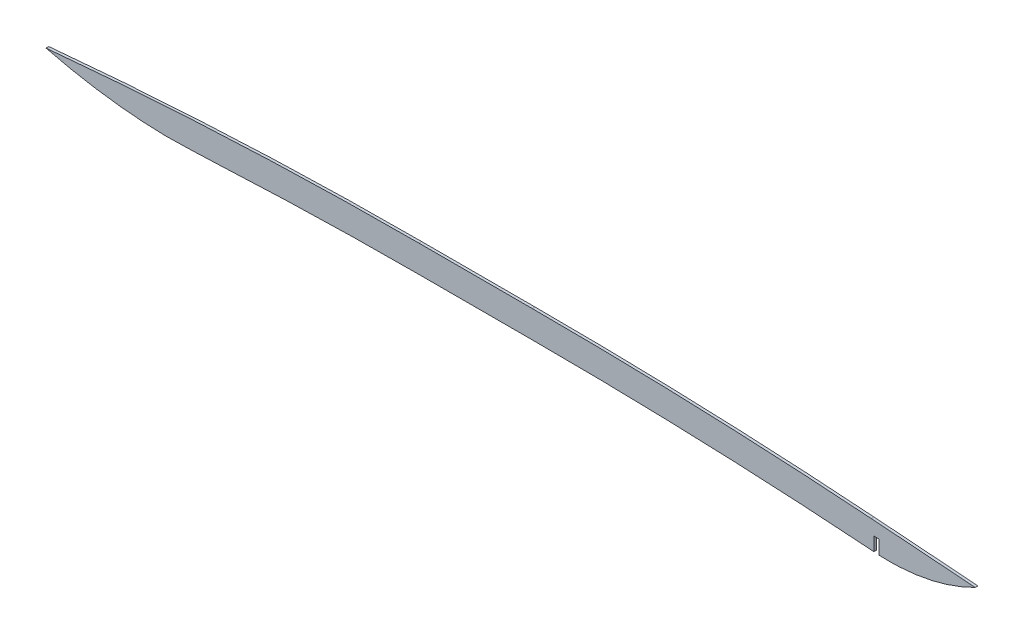
ISO-10303-21;
HEADER;
FILE_DESCRIPTION(('STEP AP214'),'2;1');
FILE_NAME('part.step','',(''),(''),'','','');
FILE_SCHEMA(('AUTOMOTIVE_DESIGN { 1 0 10303 214 1 1 1 1 }'));
ENDSEC;
DATA;
#1=APPLICATION_CONTEXT('core data for automotive mechanical design processes');
#2=APPLICATION_PROTOCOL_DEFINITION('international standard','automotive_design',2000,#1);
#3=PRODUCT_CONTEXT('',#1,'mechanical');
#4=PRODUCT('Part','Part','',(#3));
#5=PRODUCT_RELATED_PRODUCT_CATEGORY('part','',(#4));
#6=PRODUCT_DEFINITION_FORMATION('','',#4);
#7=PRODUCT_DEFINITION_CONTEXT('part definition',#1,'design');
#8=PRODUCT_DEFINITION('design','',#6,#7);
#9=PRODUCT_DEFINITION_SHAPE('','',#8);
#10=(LENGTH_UNIT() NAMED_UNIT(*) SI_UNIT(.MILLI.,.METRE.));
#11=(NAMED_UNIT(*) PLANE_ANGLE_UNIT() SI_UNIT($,.RADIAN.));
#12=(NAMED_UNIT(*) SI_UNIT($,.STERADIAN.) SOLID_ANGLE_UNIT());
#13=UNCERTAINTY_MEASURE_WITH_UNIT(LENGTH_MEASURE(1.E-05),#10,'distance_accuracy_value','');
#14=(GEOMETRIC_REPRESENTATION_CONTEXT(3) GLOBAL_UNCERTAINTY_ASSIGNED_CONTEXT((#13)) GLOBAL_UNIT_ASSIGNED_CONTEXT((#10,
#11,#12)) REPRESENTATION_CONTEXT('',''));
#15=CARTESIAN_POINT('',(0.,0.,0.));
#16=DIRECTION('',(0.,0.,1.));
#17=DIRECTION('',(1.,0.,0.));
#18=AXIS2_PLACEMENT_3D('',#15,#16,#17);
#19=CARTESIAN_POINT('',(1659.56612162198,-14511.4610731583,10.));
#20=DIRECTION('',(0.,0.,-1.));
#21=DIRECTION('',(-1.,0.,0.));
#22=AXIS2_PLACEMENT_3D('',#19,#20,#21);
#23=CYLINDRICAL_SURFACE('',#22,14606.0488219718);
#24=CARTESIAN_POINT('',(1659.56612162198,-14511.4610731583,0.));
#25=DIRECTION('',(0.,0.,1.));
#26=DIRECTION('',(1.,0.,0.));
#27=AXIS2_PLACEMENT_3D('',#24,#25,#26);
#28=CIRCLE('',#27,14606.0488219718);
#29=CARTESIAN_POINT('',(1659.56612162198,94.587748813508,0.));
#30=VERTEX_POINT('',#29);
#31=CARTESIAN_POINT('',(286.252176699048,29.88243418325,0.));
#32=VERTEX_POINT('',#31);
#33=EDGE_CURVE('E173',#30,#32,#28,.T.);
#34=ORIENTED_EDGE('',*,*,#33,.T.);
#35=DIRECTION('',(0.,0.,-1.));
#36=VECTOR('',#35,1.);
#37=CARTESIAN_POINT('',(286.252176699048,29.88243418325,10.));
#38=LINE('',#37,#36);
#39=CARTESIAN_POINT('',(286.252176699048,29.88243418325,10.));
#40=VERTEX_POINT('',#39);
#41=EDGE_CURVE('E11',#40,#32,#38,.T.);
#42=ORIENTED_EDGE('',*,*,#41,.F.);
#43=CARTESIAN_POINT('',(1659.56612162198,-14511.4610731583,10.));
#44=DIRECTION('',(0.,0.,1.));
#45=DIRECTION('',(1.,0.,0.));
#46=AXIS2_PLACEMENT_3D('',#43,#44,#45);
#47=CIRCLE('',#46,14606.0488219718);
#48=CARTESIAN_POINT('',(1659.56612162198,94.587748813508,10.));
#49=VERTEX_POINT('',#48);
#50=EDGE_CURVE('E227',#49,#40,#47,.T.);
#51=ORIENTED_EDGE('',*,*,#50,.F.);
#52=DIRECTION('',(0.,0.,-1.));
#53=VECTOR('',#52,1.);
#54=CARTESIAN_POINT('',(1659.56612162198,94.587748813508,10.));
#55=LINE('',#54,#53);
#56=EDGE_CURVE('E69',#49,#30,#55,.T.);
#57=ORIENTED_EDGE('',*,*,#56,.T.);
#58=EDGE_LOOP('',(#34,#42,#51,#57));
#59=FACE_BOUND('',#58,.T.);
#60=ADVANCED_FACE('F45',(#59),#23,.T.);
#61=CARTESIAN_POINT('',(286.252176699048,29.88243418325,10.));
#62=CARTESIAN_POINT('',(603.987522970232,-50.6580309408044,10.));
#63=CARTESIAN_POINT('',(927.370608085943,-23.9028884472763,10.));
#64=B_SPLINE_CURVE_WITH_KNOTS('',2,(#61,#62,#63),.UNSPECIFIED.,.F.,.F.,(3,3),(0.,1.),.UNSPECIFIED.);
#65=DIRECTION('',(0.,0.,-1.));
#66=VECTOR('',#65,1.);
#67=SURFACE_OF_LINEAR_EXTRUSION('',#64,#66);
#68=CARTESIAN_POINT('',(286.252176699048,29.88243418325,0.));
#69=CARTESIAN_POINT('',(603.987522970232,-50.6580309408044,0.));
#70=CARTESIAN_POINT('',(927.370608085943,-23.9028884472763,0.));
#71=B_SPLINE_CURVE_WITH_KNOTS('',2,(#68,#69,#70),.UNSPECIFIED.,.F.,.F.,(3,3),(0.,1.),.UNSPECIFIED.);
#72=CARTESIAN_POINT('',(725.000554140756,-30.1295941726138,0.));
#73=VERTEX_POINT('',#72);
#74=EDGE_CURVE('E176',#32,#73,#71,.T.);
#75=ORIENTED_EDGE('',*,*,#74,.T.);
#76=DIRECTION('',(0.,0.,-1.));
#77=VECTOR('',#76,1.);
#78=CARTESIAN_POINT('',(725.000554140756,-30.1295941726138,10.));
#79=LINE('',#78,#77);
#80=CARTESIAN_POINT('',(725.000554140756,-30.1295941726138,10.));
#81=VERTEX_POINT('',#80);
#82=EDGE_CURVE('E53',#81,#73,#79,.T.);
#83=ORIENTED_EDGE('',*,*,#82,.F.);
#84=EDGE_CURVE('E114',#40,#81,#64,.T.);
#85=ORIENTED_EDGE('',*,*,#84,.F.);
#86=ORIENTED_EDGE('',*,*,#41,.T.);
#87=EDGE_LOOP('',(#75,#83,#85,#86));
#88=FACE_BOUND('',#87,.T.);
#89=ADVANCED_FACE('F315',(#88),#67,.F.);
#90=CARTESIAN_POINT('',(0.,0.,10.));
#91=CARTESIAN_POINT('',(462.611760789785,-45.5045009401795,10.));
#92=CARTESIAN_POINT('',(927.370608085943,-23.9028884472763,10.));
#93=B_SPLINE_CURVE_WITH_KNOTS('',2,(#90,#91,#92),.UNSPECIFIED.,.F.,.F.,(3,3),(0.,1.),.UNSPECIFIED.);
#94=DIRECTION('',(0.,0.,-1.));
#95=VECTOR('',#94,1.);
#96=SURFACE_OF_LINEAR_EXTRUSION('',#93,#95);
#97=CARTESIAN_POINT('',(0.,0.,0.));
#98=CARTESIAN_POINT('',(462.611760789785,-45.5045009401795,0.));
#99=CARTESIAN_POINT('',(927.370608085943,-23.9028884472763,0.));
#100=B_SPLINE_CURVE_WITH_KNOTS('',2,(#97,#98,#99),.UNSPECIFIED.,.F.,.F.,(3,3),(0.,1.),.UNSPECIFIED.);
#101=CARTESIAN_POINT('',(927.370608085944,-23.9028884472763,0.));
#102=VERTEX_POINT('',#101);
#103=EDGE_CURVE('E182',#73,#102,#100,.T.);
#104=ORIENTED_EDGE('',*,*,#103,.T.);
#105=DIRECTION('',(0.,0.,-1.));
#106=VECTOR('',#105,1.);
#107=CARTESIAN_POINT('',(927.370608085944,-23.9028884472763,10.));
#108=LINE('',#107,#106);
#109=CARTESIAN_POINT('',(927.370608085944,-23.9028884472763,10.));
#110=VERTEX_POINT('',#109);
#111=EDGE_CURVE('E248',#110,#102,#108,.T.);
#112=ORIENTED_EDGE('',*,*,#111,.F.);
#113=EDGE_CURVE('E257',#81,#110,#93,.T.);
#114=ORIENTED_EDGE('',*,*,#113,.F.);
#115=ORIENTED_EDGE('',*,*,#82,.T.);
#116=EDGE_LOOP('',(#104,#112,#114,#115));
#117=FACE_BOUND('',#116,.T.);
#118=ADVANCED_FACE('F255',(#117),#96,.F.);
#119=CARTESIAN_POINT('',(1659.56612162198,-14511.4610731583,10.));
#120=DIRECTION('',(0.,0.,-1.));
#121=DIRECTION('',(-1.,0.,0.));
#122=AXIS2_PLACEMENT_3D('',#119,#120,#121);
#123=CYLINDRICAL_SURFACE('',#122,14506.0488219718);
#124=CARTESIAN_POINT('',(1659.56612162198,-14511.4610731583,0.));
#125=DIRECTION('',(0.,0.,1.));
#126=DIRECTION('',(1.,0.,0.));
#127=AXIS2_PLACEMENT_3D('',#124,#125,#126);
#128=CIRCLE('',#127,14506.0488219718);
#129=CARTESIAN_POINT('',(1659.56612162198,-5.41225118649202,0.));
#130=VERTEX_POINT('',#129);
#131=EDGE_CURVE('E191',#130,#102,#128,.T.);
#132=ORIENTED_EDGE('',*,*,#131,.F.);
#133=DIRECTION('',(0.,0.,-1.));
#134=VECTOR('',#133,1.);
#135=CARTESIAN_POINT('',(1659.56612162198,-5.41225118649202,10.));
#136=LINE('',#135,#134);
#137=CARTESIAN_POINT('',(1659.56612162198,-5.41225118649202,10.));
#138=VERTEX_POINT('',#137);
#139=EDGE_CURVE('E245',#138,#130,#136,.T.);
#140=ORIENTED_EDGE('',*,*,#139,.F.);
#141=CARTESIAN_POINT('',(1659.56612162198,-14511.4610731583,10.));
#142=DIRECTION('',(0.,0.,1.));
#143=DIRECTION('',(1.,0.,0.));
#144=AXIS2_PLACEMENT_3D('',#141,#142,#143);
#145=CIRCLE('',#144,14506.0488219718);
#146=EDGE_CURVE('E267',#138,#110,#145,.T.);
#147=ORIENTED_EDGE('',*,*,#146,.T.);
#148=ORIENTED_EDGE('',*,*,#111,.T.);
#149=EDGE_LOOP('',(#132,#140,#147,#148));
#150=FACE_BOUND('',#149,.T.);
#151=ADVANCED_FACE('F263',(#150),#123,.F.);
#152=CARTESIAN_POINT('',(0.,-5.41225118647613,10.));
#153=DIRECTION('',(0.,1.,0.));
#154=DIRECTION('',(-1.,0.,0.));
#155=AXIS2_PLACEMENT_3D('',#152,#153,#154);
#156=PLANE('',#155);
#157=DIRECTION('',(1.,0.,0.));
#158=VECTOR('',#157,1.);
#159=CARTESIAN_POINT('',(0.,-5.41225118647613,0.));
#160=LINE('',#159,#158);
#161=CARTESIAN_POINT('',(2076.8952330502,-5.41225118649602,0.));
#162=VERTEX_POINT('',#161);
#163=EDGE_CURVE('E198',#130,#162,#160,.T.);
#164=ORIENTED_EDGE('',*,*,#163,.T.);
#165=DIRECTION('',(0.,0.,-1.));
#166=VECTOR('',#165,1.);
#167=CARTESIAN_POINT('',(2076.8952330502,-5.41225118649602,10.));
#168=LINE('',#167,#166);
#169=CARTESIAN_POINT('',(2076.8952330502,-5.41225118649602,10.));
#170=VERTEX_POINT('',#169);
#171=EDGE_CURVE('E242',#170,#162,#168,.T.);
#172=ORIENTED_EDGE('',*,*,#171,.F.);
#173=DIRECTION('',(1.,0.,0.));
#174=VECTOR('',#173,1.);
#175=CARTESIAN_POINT('',(0.,-5.41225118647613,10.));
#176=LINE('',#175,#174);
#177=EDGE_CURVE('E269',#138,#170,#176,.T.);
#178=ORIENTED_EDGE('',*,*,#177,.F.);
#179=ORIENTED_EDGE('',*,*,#139,.T.);
#180=EDGE_LOOP('',(#164,#172,#178,#179));
#181=FACE_BOUND('',#180,.T.);
#182=ADVANCED_FACE('F307',(#181),#156,.F.);
#183=CARTESIAN_POINT('',(2076.89523305018,-17033.9955845198,10.));
#184=DIRECTION('',(0.,0.,-1.));
#185=DIRECTION('',(-1.,0.,0.));
#186=AXIS2_PLACEMENT_3D('',#183,#184,#185);
#187=CYLINDRICAL_SURFACE('',#186,17028.5833333333);
#188=CARTESIAN_POINT('',(2076.89523305018,-17033.9955845198,0.));
#189=DIRECTION('',(0.,0.,1.));
#190=DIRECTION('',(1.,0.,0.));
#191=AXIS2_PLACEMENT_3D('',#188,#189,#190);
#192=CIRCLE('',#191,17028.5833333333);
#193=CARTESIAN_POINT('',(3317.6752818634,-50.676850811012,0.));
#194=VERTEX_POINT('',#193);
#195=EDGE_CURVE('E202',#194,#162,#192,.T.);
#196=ORIENTED_EDGE('',*,*,#195,.F.);
#197=DIRECTION('',(0.,0.,-1.));
#198=VECTOR('',#197,1.);
#199=CARTESIAN_POINT('',(3317.6752818634,-50.676850811012,10.));
#200=LINE('',#199,#198);
#201=CARTESIAN_POINT('',(3317.6752818634,-50.676850811012,10.));
#202=VERTEX_POINT('',#201);
#203=EDGE_CURVE('E238',#202,#194,#200,.T.);
#204=ORIENTED_EDGE('',*,*,#203,.F.);
#205=CARTESIAN_POINT('',(2076.89523305018,-17033.9955845198,10.));
#206=DIRECTION('',(0.,0.,1.));
#207=DIRECTION('',(1.,0.,0.));
#208=AXIS2_PLACEMENT_3D('',#205,#206,#207);
#209=CIRCLE('',#208,17028.5833333333);
#210=EDGE_CURVE('E273',#202,#170,#209,.T.);
#211=ORIENTED_EDGE('',*,*,#210,.T.);
#212=ORIENTED_EDGE('',*,*,#171,.T.);
#213=EDGE_LOOP('',(#196,#204,#211,#212));
#214=FACE_BOUND('',#213,.T.);
#215=ADVANCED_FACE('F303',(#214),#187,.F.);
#216=CARTESIAN_POINT('',(-16248.6371207217,-267195.974500058,10.));
#217=DIRECTION('',(0.,0.,-1.));
#218=DIRECTION('',(-1.,0.,0.));
#219=AXIS2_PLACEMENT_3D('',#216,#217,#218);
#220=CYLINDRICAL_SURFACE('',#219,267860.879258507);
#221=DIRECTION('',(0.,0.,1.));
#222=VECTOR('',#221,1.);
#223=CARTESIAN_POINT('',(3334.95742976357,-51.9431955526102,0.));
#224=LINE('',#223,#222);
#225=CARTESIAN_POINT('',(3334.95742976357,-51.9431955526102,0.));
#226=VERTEX_POINT('',#225);
#227=CARTESIAN_POINT('',(3334.95742976357,-51.9431955526102,10.));
#228=VERTEX_POINT('',#227);
#229=EDGE_CURVE('E177',#226,#228,#224,.T.);
#230=ORIENTED_EDGE('',*,*,#229,.T.);
#231=CARTESIAN_POINT('',(-16248.6371207217,-267195.974500058,10.));
#232=DIRECTION('',(0.,0.,1.));
#233=DIRECTION('',(1.,0.,0.));
#234=AXIS2_PLACEMENT_3D('',#231,#232,#233);
#235=CIRCLE('',#234,267860.879258507);
#236=EDGE_CURVE('E284',#228,#202,#235,.T.);
#237=ORIENTED_EDGE('',*,*,#236,.T.);
#238=ORIENTED_EDGE('',*,*,#203,.T.);
#239=CARTESIAN_POINT('',(-16248.6371207217,-267195.974500058,0.));
#240=DIRECTION('',(0.,0.,1.));
#241=DIRECTION('',(1.,0.,0.));
#242=AXIS2_PLACEMENT_3D('',#239,#240,#241);
#243=CIRCLE('',#242,267860.879258507);
#244=EDGE_CURVE('E206',#226,#194,#243,.T.);
#245=ORIENTED_EDGE('',*,*,#244,.F.);
#246=EDGE_LOOP('',(#230,#237,#238,#245));
#247=FACE_BOUND('',#246,.T.);
#248=ADVANCED_FACE('F298',(#247),#220,.F.);
#249=CARTESIAN_POINT('',(3708.64261296416,20.6787942264519,10.));
#250=CARTESIAN_POINT('',(3526.26764896508,-70.9075852147113,10.));
#251=CARTESIAN_POINT('',(3317.6752818634,-50.676850811014,10.));
#252=B_SPLINE_CURVE_WITH_KNOTS('',2,(#249,#250,#251),.UNSPECIFIED.,.F.,.F.,(3,3),(0.,1.),.UNSPECIFIED.);
#253=DIRECTION('',(0.,0.,-1.));
#254=VECTOR('',#253,1.);
#255=SURFACE_OF_LINEAR_EXTRUSION('',#252,#254);
#256=CARTESIAN_POINT('',(3708.64261296416,20.6787942264519,0.));
#257=CARTESIAN_POINT('',(3526.26764896508,-70.9075852147113,0.));
#258=CARTESIAN_POINT('',(3317.6752818634,-50.676850811014,0.));
#259=B_SPLINE_CURVE_WITH_KNOTS('',2,(#256,#257,#258),.UNSPECIFIED.,.F.,.F.,(3,3),(0.,1.),.UNSPECIFIED.);
#260=CARTESIAN_POINT('',(3708.64261296419,20.6787942264555,0.));
#261=VERTEX_POINT('',#260);
#262=CARTESIAN_POINT('',(3354.95742976357,-53.4100932593446,0.));
#263=VERTEX_POINT('',#262);
#264=EDGE_CURVE('E209',#261,#263,#259,.T.);
#265=ORIENTED_EDGE('',*,*,#264,.F.);
#266=DIRECTION('',(0.,0.,-1.));
#267=VECTOR('',#266,1.);
#268=CARTESIAN_POINT('',(3708.64261296419,20.6787942264555,10.));
#269=LINE('',#268,#267);
#270=CARTESIAN_POINT('',(3708.64261296419,20.6787942264555,10.));
#271=VERTEX_POINT('',#270);
#272=EDGE_CURVE('E162',#271,#261,#269,.T.);
#273=ORIENTED_EDGE('',*,*,#272,.F.);
#274=CARTESIAN_POINT('',(3354.95742976357,-53.4100932593446,10.));
#275=VERTEX_POINT('',#274);
#276=EDGE_CURVE('E149',#271,#275,#252,.T.);
#277=ORIENTED_EDGE('',*,*,#276,.T.);
#278=DIRECTION('',(0.,0.,-1.));
#279=VECTOR('',#278,1.);
#280=CARTESIAN_POINT('',(3354.95742976357,-53.4100932593446,10.));
#281=LINE('',#280,#279);
#282=EDGE_CURVE('E234',#275,#263,#281,.T.);
#283=ORIENTED_EDGE('',*,*,#282,.T.);
#284=EDGE_LOOP('',(#265,#273,#277,#283));
#285=FACE_BOUND('',#284,.T.);
#286=ADVANCED_FACE('F294',(#285),#255,.T.);
#287=CARTESIAN_POINT('',(-16248.6370348164,-267195.974508019,10.));
#288=DIRECTION('',(0.,0.,-1.));
#289=DIRECTION('',(-1.,0.,0.));
#290=AXIS2_PLACEMENT_3D('',#287,#288,#289);
#291=CYLINDRICAL_SURFACE('',#290,267960.879258507);
#292=CARTESIAN_POINT('',(-16248.6370348164,-267195.974508019,0.));
#293=DIRECTION('',(0.,0.,1.));
#294=DIRECTION('',(1.,0.,0.));
#295=AXIS2_PLACEMENT_3D('',#292,#293,#294);
#296=CIRCLE('',#295,267960.879258507);
#297=CARTESIAN_POINT('',(3324.9617367876,49.0573337729998,0.));
#298=VERTEX_POINT('',#297);
#299=EDGE_CURVE('E157',#261,#298,#296,.T.);
#300=ORIENTED_EDGE('',*,*,#299,.T.);
#301=DIRECTION('',(0.,0.,-1.));
#302=VECTOR('',#301,1.);
#303=CARTESIAN_POINT('',(3324.9617367876,49.0573337729998,10.));
#304=LINE('',#303,#302);
#305=CARTESIAN_POINT('',(3324.9617367876,49.0573337729998,10.));
#306=VERTEX_POINT('',#305);
#307=EDGE_CURVE('E154',#306,#298,#304,.T.);
#308=ORIENTED_EDGE('',*,*,#307,.F.);
#309=CARTESIAN_POINT('',(-16248.6370348164,-267195.974508019,10.));
#310=DIRECTION('',(0.,0.,1.));
#311=DIRECTION('',(1.,0.,0.));
#312=AXIS2_PLACEMENT_3D('',#309,#310,#311);
#313=CIRCLE('',#312,267960.879258507);
#314=EDGE_CURVE('E139',#271,#306,#313,.T.);
#315=ORIENTED_EDGE('',*,*,#314,.F.);
#316=ORIENTED_EDGE('',*,*,#272,.T.);
#317=EDGE_LOOP('',(#300,#308,#315,#316));
#318=FACE_BOUND('',#317,.T.);
#319=ADVANCED_FACE('F155',(#318),#291,.T.);
#320=CARTESIAN_POINT('',(2076.89523305018,-17033.9955845198,10.));
#321=DIRECTION('',(0.,0.,-1.));
#322=DIRECTION('',(-1.,0.,0.));
#323=AXIS2_PLACEMENT_3D('',#320,#321,#322);
#324=CYLINDRICAL_SURFACE('',#323,17128.5833333333);
#325=CARTESIAN_POINT('',(2076.89523305018,-17033.9955845198,0.));
#326=DIRECTION('',(0.,0.,1.));
#327=DIRECTION('',(1.,0.,0.));
#328=AXIS2_PLACEMENT_3D('',#325,#326,#327);
#329=CIRCLE('',#328,17128.5833333333);
#330=CARTESIAN_POINT('',(2076.8952330502,94.5877488135061,0.));
#331=VERTEX_POINT('',#330);
#332=EDGE_CURVE('E220',#298,#331,#329,.T.);
#333=ORIENTED_EDGE('',*,*,#332,.T.);
#334=DIRECTION('',(0.,0.,-1.));
#335=VECTOR('',#334,1.);
#336=CARTESIAN_POINT('',(2076.8952330502,94.5877488135061,10.));
#337=LINE('',#336,#335);
#338=CARTESIAN_POINT('',(2076.8952330502,94.5877488135061,10.));
#339=VERTEX_POINT('',#338);
#340=EDGE_CURVE('E163',#339,#331,#337,.T.);
#341=ORIENTED_EDGE('',*,*,#340,.F.);
#342=CARTESIAN_POINT('',(2076.89523305018,-17033.9955845198,10.));
#343=DIRECTION('',(0.,0.,1.));
#344=DIRECTION('',(1.,0.,0.));
#345=AXIS2_PLACEMENT_3D('',#342,#343,#344);
#346=CIRCLE('',#345,17128.5833333333);
#347=EDGE_CURVE('E145',#306,#339,#346,.T.);
#348=ORIENTED_EDGE('',*,*,#347,.F.);
#349=ORIENTED_EDGE('',*,*,#307,.T.);
#350=EDGE_LOOP('',(#333,#341,#348,#349));
#351=FACE_BOUND('',#350,.T.);
#352=ADVANCED_FACE('F165',(#351),#324,.T.);
#353=CARTESIAN_POINT('',(4.34065768814807E-13,94.5877488135156,10.));
#354=DIRECTION('',(0.,1.,0.));
#355=DIRECTION('',(-1.,0.,0.));
#356=AXIS2_PLACEMENT_3D('',#353,#354,#355);
#357=PLANE('',#356);
#358=DIRECTION('',(1.,0.,0.));
#359=VECTOR('',#358,1.);
#360=CARTESIAN_POINT('',(4.34065768814807E-13,94.5877488135156,0.));
#361=LINE('',#360,#359);
#362=EDGE_CURVE('E223',#30,#331,#361,.T.);
#363=ORIENTED_EDGE('',*,*,#362,.F.);
#364=ORIENTED_EDGE('',*,*,#56,.F.);
#365=DIRECTION('',(1.,0.,0.));
#366=VECTOR('',#365,1.);
#367=CARTESIAN_POINT('',(4.34065768814807E-13,94.5877488135156,10.));
#368=LINE('',#367,#366);
#369=EDGE_CURVE('E167',#49,#339,#368,.T.);
#370=ORIENTED_EDGE('',*,*,#369,.T.);
#371=ORIENTED_EDGE('',*,*,#340,.T.);
#372=EDGE_LOOP('',(#363,#364,#370,#371));
#373=FACE_BOUND('',#372,.T.);
#374=ADVANCED_FACE('F397',(#373),#357,.T.);
#375=CARTESIAN_POINT('',(0.,0.,10.));
#376=DIRECTION('',(0.,0.,1.));
#377=DIRECTION('',(1.,0.,0.));
#378=AXIS2_PLACEMENT_3D('',#375,#376,#377);
#379=PLANE('',#378);
#380=DIRECTION('',(0.,-1.,0.));
#381=VECTOR('',#380,1.);
#382=CARTESIAN_POINT('',(3334.95742976357,-51.9431955526102,10.));
#383=LINE('',#382,#381);
#384=CARTESIAN_POINT('',(3334.95742976357,-1.94319555255333,10.));
#385=VERTEX_POINT('',#384);
#386=EDGE_CURVE('E338',#385,#228,#383,.T.);
#387=ORIENTED_EDGE('',*,*,#386,.F.);
#388=DIRECTION('',(-1.,0.,0.));
#389=VECTOR('',#388,1.);
#390=CARTESIAN_POINT('',(3334.95742976357,-1.94319555255333,10.));
#391=LINE('',#390,#389);
#392=CARTESIAN_POINT('',(3354.95742976357,-1.94319555255333,10.));
#393=VERTEX_POINT('',#392);
#394=EDGE_CURVE('E343',#393,#385,#391,.T.);
#395=ORIENTED_EDGE('',*,*,#394,.F.);
#396=DIRECTION('',(0.,1.,0.));
#397=VECTOR('',#396,1.);
#398=CARTESIAN_POINT('',(3354.95742976357,-53.4100932593446,10.));
#399=LINE('',#398,#397);
#400=EDGE_CURVE('E347',#275,#393,#399,.T.);
#401=ORIENTED_EDGE('',*,*,#400,.F.);
#402=ORIENTED_EDGE('',*,*,#276,.F.);
#403=ORIENTED_EDGE('',*,*,#314,.T.);
#404=ORIENTED_EDGE('',*,*,#347,.T.);
#405=ORIENTED_EDGE('',*,*,#369,.F.);
#406=ORIENTED_EDGE('',*,*,#50,.T.);
#407=ORIENTED_EDGE('',*,*,#84,.T.);
#408=ORIENTED_EDGE('',*,*,#113,.T.);
#409=ORIENTED_EDGE('',*,*,#146,.F.);
#410=ORIENTED_EDGE('',*,*,#177,.T.);
#411=ORIENTED_EDGE('',*,*,#210,.F.);
#412=ORIENTED_EDGE('',*,*,#236,.F.);
#413=EDGE_LOOP('',(#387,#395,#401,#402,#403,#404,#405,#406,#407,#408,#409,#410,#411,#412));
#414=FACE_BOUND('',#413,.T.);
#415=ADVANCED_FACE('F142',(#414),#379,.T.);
#416=CARTESIAN_POINT('',(0.,0.,0.));
#417=DIRECTION('',(0.,0.,1.));
#418=DIRECTION('',(1.,0.,0.));
#419=AXIS2_PLACEMENT_3D('',#416,#417,#418);
#420=PLANE('',#419);
#421=DIRECTION('',(-1.,0.,0.));
#422=VECTOR('',#421,1.);
#423=CARTESIAN_POINT('',(3334.95742976357,-1.94319555255333,0.));
#424=LINE('',#423,#422);
#425=CARTESIAN_POINT('',(3354.95742976357,-1.94319555255333,0.));
#426=VERTEX_POINT('',#425);
#427=CARTESIAN_POINT('',(3334.95742976357,-1.94319555255333,0.));
#428=VERTEX_POINT('',#427);
#429=EDGE_CURVE('E60',#426,#428,#424,.T.);
#430=ORIENTED_EDGE('',*,*,#429,.T.);
#431=DIRECTION('',(0.,-1.,0.));
#432=VECTOR('',#431,1.);
#433=CARTESIAN_POINT('',(3334.95742976357,-51.9431955526102,0.));
#434=LINE('',#433,#432);
#435=EDGE_CURVE('E331',#428,#226,#434,.T.);
#436=ORIENTED_EDGE('',*,*,#435,.T.);
#437=ORIENTED_EDGE('',*,*,#244,.T.);
#438=ORIENTED_EDGE('',*,*,#195,.T.);
#439=ORIENTED_EDGE('',*,*,#163,.F.);
#440=ORIENTED_EDGE('',*,*,#131,.T.);
#441=ORIENTED_EDGE('',*,*,#103,.F.);
#442=ORIENTED_EDGE('',*,*,#74,.F.);
#443=ORIENTED_EDGE('',*,*,#33,.F.);
#444=ORIENTED_EDGE('',*,*,#362,.T.);
#445=ORIENTED_EDGE('',*,*,#332,.F.);
#446=ORIENTED_EDGE('',*,*,#299,.F.);
#447=ORIENTED_EDGE('',*,*,#264,.T.);
#448=DIRECTION('',(0.,1.,0.));
#449=VECTOR('',#448,1.);
#450=CARTESIAN_POINT('',(3354.95742976357,-53.4100932593446,0.));
#451=LINE('',#450,#449);
#452=EDGE_CURVE('E342',#263,#426,#451,.T.);
#453=ORIENTED_EDGE('',*,*,#452,.T.);
#454=EDGE_LOOP('',(#430,#436,#437,#438,#439,#440,#441,#442,#443,#444,#445,#446,#447,#453));
#455=FACE_BOUND('',#454,.T.);
#456=ADVANCED_FACE('F259',(#455),#420,.F.);
#457=CARTESIAN_POINT('',(3334.95742976357,-51.9431955526102,0.));
#458=DIRECTION('',(-1.,0.,0.));
#459=DIRECTION('',(0.,-1.,0.));
#460=AXIS2_PLACEMENT_3D('',#457,#458,#459);
#461=PLANE('',#460);
#462=ORIENTED_EDGE('',*,*,#386,.T.);
#463=ORIENTED_EDGE('',*,*,#229,.F.);
#464=ORIENTED_EDGE('',*,*,#435,.F.);
#465=DIRECTION('',(0.,0.,1.));
#466=VECTOR('',#465,1.);
#467=CARTESIAN_POINT('',(3334.95742976357,-1.94319555255333,0.));
#468=LINE('',#467,#466);
#469=EDGE_CURVE('E330',#428,#385,#468,.T.);
#470=ORIENTED_EDGE('',*,*,#469,.T.);
#471=EDGE_LOOP('',(#462,#463,#464,#470));
#472=FACE_BOUND('',#471,.T.);
#473=ADVANCED_FACE('F376',(#472),#461,.F.);
#474=CARTESIAN_POINT('',(3334.95742976357,-1.94319555255333,0.));
#475=DIRECTION('',(0.,1.,0.));
#476=DIRECTION('',(0.,0.,1.));
#477=AXIS2_PLACEMENT_3D('',#474,#475,#476);
#478=PLANE('',#477);
#479=ORIENTED_EDGE('',*,*,#394,.T.);
#480=ORIENTED_EDGE('',*,*,#469,.F.);
#481=ORIENTED_EDGE('',*,*,#429,.F.);
#482=DIRECTION('',(0.,0.,1.));
#483=VECTOR('',#482,1.);
#484=CARTESIAN_POINT('',(3354.95742976357,-1.94319555255333,0.));
#485=LINE('',#484,#483);
#486=EDGE_CURVE('E327',#426,#393,#485,.T.);
#487=ORIENTED_EDGE('',*,*,#486,.T.);
#488=EDGE_LOOP('',(#479,#480,#481,#487));
#489=FACE_BOUND('',#488,.T.);
#490=ADVANCED_FACE('F384',(#489),#478,.F.);
#491=CARTESIAN_POINT('',(3354.95742976357,-53.4100932593446,0.));
#492=DIRECTION('',(1.,0.,0.));
#493=DIRECTION('',(0.,0.,-1.));
#494=AXIS2_PLACEMENT_3D('',#491,#492,#493);
#495=PLANE('',#494);
#496=ORIENTED_EDGE('',*,*,#400,.T.);
#497=ORIENTED_EDGE('',*,*,#486,.F.);
#498=ORIENTED_EDGE('',*,*,#452,.F.);
#499=ORIENTED_EDGE('',*,*,#282,.F.);
#500=EDGE_LOOP('',(#496,#497,#498,#499));
#501=FACE_BOUND('',#500,.T.);
#502=ADVANCED_FACE('F364',(#501),#495,.F.);
#503=CLOSED_SHELL('',(#60,#89,#118,#151,#182,#215,#248,#286,#319,#352,#374,#415,#456,#473,#490,#502));
#504=MANIFOLD_SOLID_BREP('B2',#503);
#505=ADVANCED_BREP_SHAPE_REPRESENTATION('',(#18,#504),#14);
#506=SHAPE_DEFINITION_REPRESENTATION(#9,#505);
ENDSEC;
END-ISO-10303-21;
